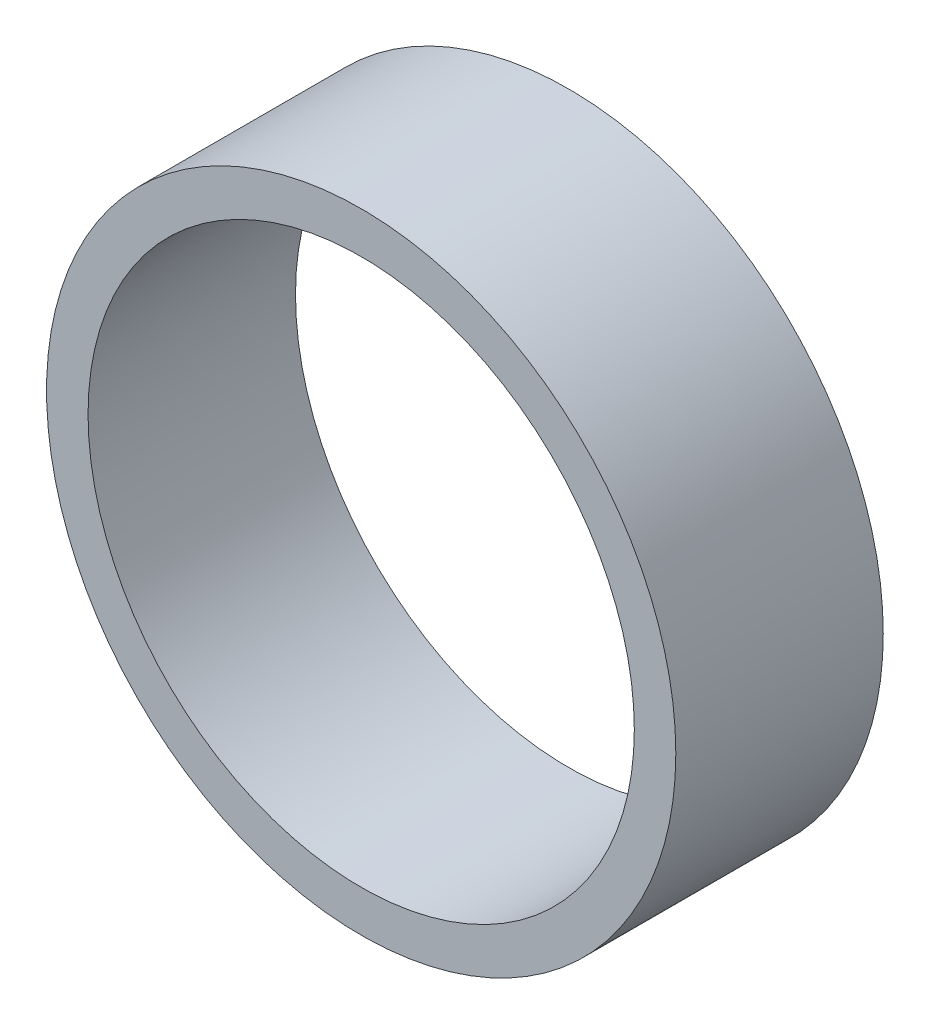
ISO-10303-21;
HEADER;
FILE_DESCRIPTION(('STEP AP214'),'2;1');
FILE_NAME('part.step','',(''),(''),'','','');
FILE_SCHEMA(('AUTOMOTIVE_DESIGN { 1 0 10303 214 1 1 1 1 }'));
ENDSEC;
DATA;
#1=APPLICATION_CONTEXT('core data for automotive mechanical design processes');
#2=APPLICATION_PROTOCOL_DEFINITION('international standard','automotive_design',2000,#1);
#3=PRODUCT_CONTEXT('',#1,'mechanical');
#4=PRODUCT('Part','Part','',(#3));
#5=PRODUCT_RELATED_PRODUCT_CATEGORY('part','',(#4));
#6=PRODUCT_DEFINITION_FORMATION('','',#4);
#7=PRODUCT_DEFINITION_CONTEXT('part definition',#1,'design');
#8=PRODUCT_DEFINITION('design','',#6,#7);
#9=PRODUCT_DEFINITION_SHAPE('','',#8);
#10=(LENGTH_UNIT() NAMED_UNIT(*) SI_UNIT(.MILLI.,.METRE.));
#11=(NAMED_UNIT(*) PLANE_ANGLE_UNIT() SI_UNIT($,.RADIAN.));
#12=(NAMED_UNIT(*) SI_UNIT($,.STERADIAN.) SOLID_ANGLE_UNIT());
#13=UNCERTAINTY_MEASURE_WITH_UNIT(LENGTH_MEASURE(1.E-05),#10,'distance_accuracy_value','');
#14=(GEOMETRIC_REPRESENTATION_CONTEXT(3) GLOBAL_UNCERTAINTY_ASSIGNED_CONTEXT((#13)) GLOBAL_UNIT_ASSIGNED_CONTEXT((#10,
#11,#12)) REPRESENTATION_CONTEXT('',''));
#15=CARTESIAN_POINT('',(0.,0.,0.));
#16=DIRECTION('',(0.,0.,1.));
#17=DIRECTION('',(1.,0.,0.));
#18=AXIS2_PLACEMENT_3D('',#15,#16,#17);
#19=CARTESIAN_POINT('',(0.,0.,15.));
#20=DIRECTION('',(0.,0.,-1.));
#21=DIRECTION('',(-1.,0.,0.));
#22=AXIS2_PLACEMENT_3D('',#19,#20,#21);
#23=CYLINDRICAL_SURFACE('',#22,22.75);
#24=CARTESIAN_POINT('',(0.,0.,15.));
#25=DIRECTION('',(0.,0.,1.));
#26=DIRECTION('',(1.,0.,0.));
#27=AXIS2_PLACEMENT_3D('',#24,#25,#26);
#28=CIRCLE('',#27,22.75);
#29=CARTESIAN_POINT('',(22.75,0.,15.));
#30=VERTEX_POINT('',#29);
#31=EDGE_CURVE('E10',#30,#30,#28,.T.);
#32=ORIENTED_EDGE('',*,*,#31,.F.);
#33=EDGE_LOOP('',(#32));
#34=FACE_BOUND('',#33,.T.);
#35=CARTESIAN_POINT('',(0.,0.,0.));
#36=DIRECTION('',(0.,0.,1.));
#37=DIRECTION('',(1.,0.,0.));
#38=AXIS2_PLACEMENT_3D('',#35,#36,#37);
#39=CIRCLE('',#38,22.75);
#40=CARTESIAN_POINT('',(22.75,0.,0.));
#41=VERTEX_POINT('',#40);
#42=EDGE_CURVE('E36',#41,#41,#39,.T.);
#43=ORIENTED_EDGE('',*,*,#42,.T.);
#44=EDGE_LOOP('',(#43));
#45=FACE_BOUND('',#44,.T.);
#46=ADVANCED_FACE('F33',(#34,#45),#23,.T.);
#47=CARTESIAN_POINT('',(0.,0.,15.));
#48=DIRECTION('',(0.,0.,1.));
#49=DIRECTION('',(1.,0.,0.));
#50=AXIS2_PLACEMENT_3D('',#47,#48,#49);
#51=PLANE('',#50);
#52=CARTESIAN_POINT('',(0.,0.,15.));
#53=DIRECTION('',(0.,0.,1.));
#54=DIRECTION('',(1.,0.,0.));
#55=AXIS2_PLACEMENT_3D('',#52,#53,#54);
#56=CIRCLE('',#55,19.75);
#57=CARTESIAN_POINT('',(19.75,0.,15.));
#58=VERTEX_POINT('',#57);
#59=EDGE_CURVE('E45',#58,#58,#56,.T.);
#60=ORIENTED_EDGE('',*,*,#59,.F.);
#61=EDGE_LOOP('',(#60));
#62=FACE_BOUND('',#61,.T.);
#63=ORIENTED_EDGE('',*,*,#31,.T.);
#64=EDGE_LOOP('',(#63));
#65=FACE_BOUND('',#64,.T.);
#66=ADVANCED_FACE('F60',(#62,#65),#51,.T.);
#67=CARTESIAN_POINT('',(0.,0.,0.));
#68=DIRECTION('',(0.,0.,1.));
#69=DIRECTION('',(1.,0.,0.));
#70=AXIS2_PLACEMENT_3D('',#67,#68,#69);
#71=PLANE('',#70);
#72=CARTESIAN_POINT('',(0.,0.,0.));
#73=DIRECTION('',(0.,0.,1.));
#74=DIRECTION('',(1.,0.,0.));
#75=AXIS2_PLACEMENT_3D('',#72,#73,#74);
#76=CIRCLE('',#75,19.75);
#77=CARTESIAN_POINT('',(19.75,0.,0.));
#78=VERTEX_POINT('',#77);
#79=EDGE_CURVE('E43',#78,#78,#76,.T.);
#80=ORIENTED_EDGE('',*,*,#79,.T.);
#81=EDGE_LOOP('',(#80));
#82=FACE_BOUND('',#81,.T.);
#83=ORIENTED_EDGE('',*,*,#42,.F.);
#84=EDGE_LOOP('',(#83));
#85=FACE_BOUND('',#84,.T.);
#86=ADVANCED_FACE('F51',(#82,#85),#71,.F.);
#87=CARTESIAN_POINT('',(0.,0.,0.));
#88=DIRECTION('',(0.,0.,1.));
#89=DIRECTION('',(1.,0.,0.));
#90=AXIS2_PLACEMENT_3D('',#87,#88,#89);
#91=CYLINDRICAL_SURFACE('',#90,19.75);
#92=ORIENTED_EDGE('',*,*,#79,.F.);
#93=EDGE_LOOP('',(#92));
#94=FACE_BOUND('',#93,.T.);
#95=ORIENTED_EDGE('',*,*,#59,.T.);
#96=EDGE_LOOP('',(#95));
#97=FACE_BOUND('',#96,.T.);
#98=ADVANCED_FACE('F54',(#94,#97),#91,.F.);
#99=CLOSED_SHELL('',(#46,#66,#86,#98));
#100=MANIFOLD_SOLID_BREP('B2',#99);
#101=ADVANCED_BREP_SHAPE_REPRESENTATION('',(#18,#100),#14);
#102=SHAPE_DEFINITION_REPRESENTATION(#9,#101);
ENDSEC;
END-ISO-10303-21;
